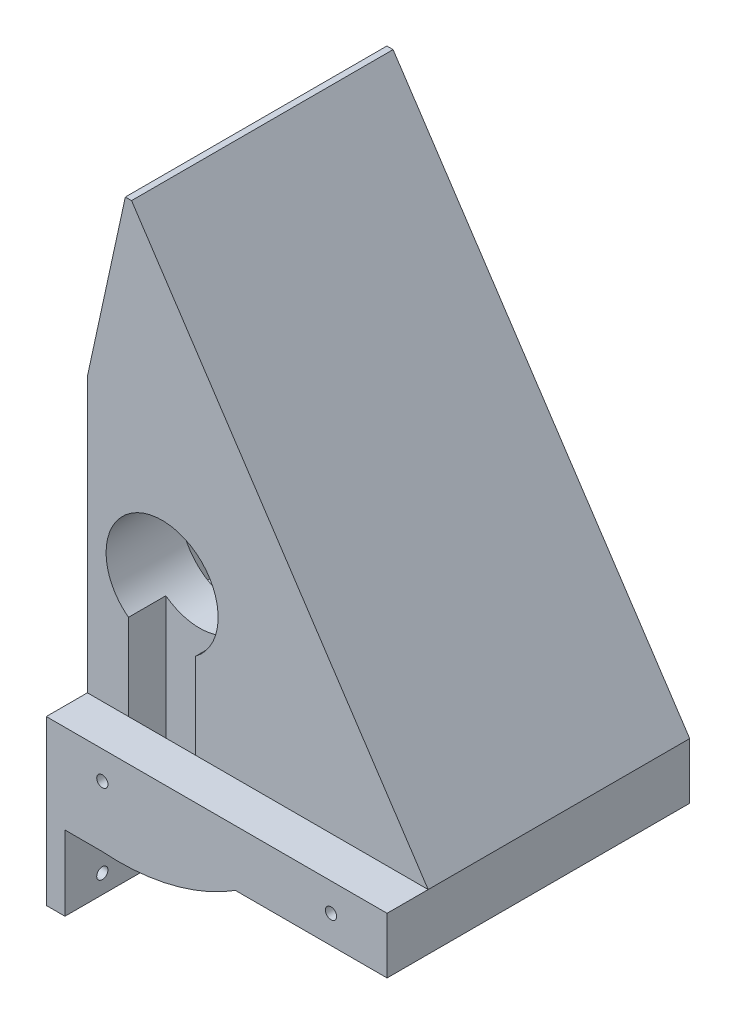
ISO-10303-21;
HEADER;
FILE_DESCRIPTION(('STEP AP214'),'2;1');
FILE_NAME('part.step','',(''),(''),'','','');
FILE_SCHEMA(('AUTOMOTIVE_DESIGN { 1 0 10303 214 1 1 1 1 }'));
ENDSEC;
DATA;
#1=APPLICATION_CONTEXT('core data for automotive mechanical design processes');
#2=APPLICATION_PROTOCOL_DEFINITION('international standard','automotive_design',2000,#1);
#3=PRODUCT_CONTEXT('',#1,'mechanical');
#4=PRODUCT('Part','Part','',(#3));
#5=PRODUCT_RELATED_PRODUCT_CATEGORY('part','',(#4));
#6=PRODUCT_DEFINITION_FORMATION('','',#4);
#7=PRODUCT_DEFINITION_CONTEXT('part definition',#1,'design');
#8=PRODUCT_DEFINITION('design','',#6,#7);
#9=PRODUCT_DEFINITION_SHAPE('','',#8);
#10=(LENGTH_UNIT() NAMED_UNIT(*) SI_UNIT(.MILLI.,.METRE.));
#11=(NAMED_UNIT(*) PLANE_ANGLE_UNIT() SI_UNIT($,.RADIAN.));
#12=(NAMED_UNIT(*) SI_UNIT($,.STERADIAN.) SOLID_ANGLE_UNIT());
#13=UNCERTAINTY_MEASURE_WITH_UNIT(LENGTH_MEASURE(1.E-05),#10,'distance_accuracy_value','');
#14=(GEOMETRIC_REPRESENTATION_CONTEXT(3) GLOBAL_UNCERTAINTY_ASSIGNED_CONTEXT((#13)) GLOBAL_UNIT_ASSIGNED_CONTEXT((#10,
#11,#12)) REPRESENTATION_CONTEXT('',''));
#15=CARTESIAN_POINT('',(0.,0.,0.));
#16=DIRECTION('',(0.,0.,1.));
#17=DIRECTION('',(1.,0.,0.));
#18=AXIS2_PLACEMENT_3D('',#15,#16,#17);
#19=CARTESIAN_POINT('',(-1.2E-05,-23.7978478395397,-270.));
#20=DIRECTION('',(0.,-1.,0.));
#21=DIRECTION('',(0.,0.,-1.));
#22=AXIS2_PLACEMENT_3D('',#19,#20,#21);
#23=PLANE('',#22);
#24=DIRECTION('',(1.,0.,0.));
#25=VECTOR('',#24,1.);
#26=CARTESIAN_POINT('',(0.,-23.7978478395397,-189.));
#27=LINE('',#26,#25);
#28=CARTESIAN_POINT('',(4.99999999999999,-23.7978478395397,-189.));
#29=VERTEX_POINT('',#28);
#30=CARTESIAN_POINT('',(15.,-23.7978478395397,-189.));
#31=VERTEX_POINT('',#30);
#32=EDGE_CURVE('E11',#29,#31,#27,.T.);
#33=ORIENTED_EDGE('',*,*,#32,.F.);
#34=DIRECTION('',(0.,0.,1.));
#35=VECTOR('',#34,1.);
#36=CARTESIAN_POINT('',(4.99999999999999,-23.7978478395397,-189.));
#37=LINE('',#36,#35);
#38=CARTESIAN_POINT('',(5.,-23.7978478395397,-270.));
#39=VERTEX_POINT('',#38);
#40=EDGE_CURVE('E252',#39,#29,#37,.T.);
#41=ORIENTED_EDGE('',*,*,#40,.F.);
#42=DIRECTION('',(1.,0.,0.));
#43=VECTOR('',#42,1.);
#44=CARTESIAN_POINT('',(-1.2E-05,-23.7978478395397,-270.));
#45=LINE('',#44,#43);
#46=CARTESIAN_POINT('',(15.,-23.7978478395397,-270.));
#47=VERTEX_POINT('',#46);
#48=EDGE_CURVE('E263',#39,#47,#45,.T.);
#49=ORIENTED_EDGE('',*,*,#48,.T.);
#50=DIRECTION('',(0.,0.,-1.));
#51=VECTOR('',#50,1.);
#52=CARTESIAN_POINT('',(15.,-23.7978478395397,-189.));
#53=LINE('',#52,#51);
#54=CARTESIAN_POINT('',(15.,-23.7978478395397,-210.));
#55=VERTEX_POINT('',#54);
#56=EDGE_CURVE('E289',#55,#47,#53,.T.);
#57=ORIENTED_EDGE('',*,*,#56,.F.);
#58=DIRECTION('',(1.,0.,0.));
#59=VECTOR('',#58,1.);
#60=CARTESIAN_POINT('',(0.,-23.7978478395397,-210.));
#61=LINE('',#60,#59);
#62=CARTESIAN_POINT('',(11.,-23.7978478395397,-210.));
#63=VERTEX_POINT('',#62);
#64=EDGE_CURVE('E269',#63,#55,#61,.T.);
#65=ORIENTED_EDGE('',*,*,#64,.F.);
#66=DIRECTION('',(0.,0.,1.));
#67=VECTOR('',#66,1.);
#68=CARTESIAN_POINT('',(11.,-23.7978478395397,-210.));
#69=LINE('',#68,#67);
#70=CARTESIAN_POINT('',(11.,-23.7978478395397,-200.));
#71=VERTEX_POINT('',#70);
#72=EDGE_CURVE('E267',#63,#71,#69,.T.);
#73=ORIENTED_EDGE('',*,*,#72,.T.);
#74=DIRECTION('',(1.,0.,0.));
#75=VECTOR('',#74,1.);
#76=CARTESIAN_POINT('',(11.,-23.7978478395397,-200.));
#77=LINE('',#76,#75);
#78=CARTESIAN_POINT('',(15.,-23.7978478395397,-200.));
#79=VERTEX_POINT('',#78);
#80=EDGE_CURVE('E265',#71,#79,#77,.T.);
#81=ORIENTED_EDGE('',*,*,#80,.T.);
#82=EDGE_CURVE('E296',#31,#79,#53,.T.);
#83=ORIENTED_EDGE('',*,*,#82,.F.);
#84=EDGE_LOOP('',(#33,#41,#49,#57,#65,#73,#81,#83));
#85=FACE_BOUND('',#84,.T.);
#86=ADVANCED_FACE('F41',(#85),#23,.T.);
#87=CARTESIAN_POINT('',(0.,-100.282814982748,-32.0135944600556));
#88=DIRECTION('',(1.,0.,0.));
#89=DIRECTION('',(0.,0.,-1.));
#90=AXIS2_PLACEMENT_3D('',#87,#88,#89);
#91=PLANE('',#90);
#92=CARTESIAN_POINT('',(0.,-38.7978478395397,-260.));
#93=DIRECTION('',(1.,0.,0.));
#94=DIRECTION('',(0.,0.,-1.));
#95=AXIS2_PLACEMENT_3D('',#92,#93,#94);
#96=CIRCLE('',#95,1.50000000000002);
#97=CARTESIAN_POINT('',(0.,-38.7978478395397,-261.5));
#98=VERTEX_POINT('',#97);
#99=EDGE_CURVE('E254',#98,#98,#96,.T.);
#100=ORIENTED_EDGE('',*,*,#99,.T.);
#101=EDGE_LOOP('',(#100));
#102=FACE_BOUND('',#101,.T.);
#103=CARTESIAN_POINT('',(0.,-38.7978478395397,-199.));
#104=DIRECTION('',(1.,0.,0.));
#105=DIRECTION('',(0.,0.,-1.));
#106=AXIS2_PLACEMENT_3D('',#103,#104,#105);
#107=CIRCLE('',#106,1.50000000000002);
#108=CARTESIAN_POINT('',(0.,-38.7978478395397,-200.5));
#109=VERTEX_POINT('',#108);
#110=EDGE_CURVE('E903',#109,#109,#107,.T.);
#111=ORIENTED_EDGE('',*,*,#110,.T.);
#112=EDGE_LOOP('',(#111));
#113=FACE_BOUND('',#112,.T.);
#114=DIRECTION('',(0.,1.,0.));
#115=VECTOR('',#114,1.);
#116=CARTESIAN_POINT('',(0.,0.,-270.));
#117=LINE('',#116,#115);
#118=CARTESIAN_POINT('',(0.,-43.7978478395397,-270.));
#119=VERTEX_POINT('',#118);
#120=CARTESIAN_POINT('',(0.,-4.35229791402416,-270.));
#121=VERTEX_POINT('',#120);
#122=EDGE_CURVE('E227',#119,#121,#117,.T.);
#123=ORIENTED_EDGE('',*,*,#122,.F.);
#124=DIRECTION('',(0.,0.,-1.));
#125=VECTOR('',#124,1.);
#126=CARTESIAN_POINT('',(0.,-43.7978478395397,-189.));
#127=LINE('',#126,#125);
#128=CARTESIAN_POINT('',(0.,-43.7978478395397,-189.));
#129=VERTEX_POINT('',#128);
#130=EDGE_CURVE('E232',#129,#119,#127,.T.);
#131=ORIENTED_EDGE('',*,*,#130,.F.);
#132=DIRECTION('',(0.,-1.,0.));
#133=VECTOR('',#132,1.);
#134=CARTESIAN_POINT('',(0.,0.,-189.));
#135=LINE('',#134,#133);
#136=CARTESIAN_POINT('',(0.,0.,-189.));
#137=VERTEX_POINT('',#136);
#138=EDGE_CURVE('E272',#137,#129,#135,.T.);
#139=ORIENTED_EDGE('',*,*,#138,.F.);
#140=DIRECTION('',(0.,0.,1.));
#141=VECTOR('',#140,1.);
#142=CARTESIAN_POINT('',(0.,0.,0.));
#143=LINE('',#142,#141);
#144=CARTESIAN_POINT('',(0.,0.,-200.));
#145=VERTEX_POINT('',#144);
#146=EDGE_CURVE('E238',#145,#137,#143,.T.);
#147=ORIENTED_EDGE('',*,*,#146,.F.);
#148=DIRECTION('',(0.,-1.,0.));
#149=VECTOR('',#148,1.);
#150=CARTESIAN_POINT('',(0.,120.,-200.));
#151=LINE('',#150,#149);
#152=CARTESIAN_POINT('',(0.,73.3522979140246,-200.));
#153=VERTEX_POINT('',#152);
#154=EDGE_CURVE('E239',#153,#145,#151,.T.);
#155=ORIENTED_EDGE('',*,*,#154,.F.);
#156=DIRECTION('',(0.,0.,1.));
#157=VECTOR('',#156,1.);
#158=CARTESIAN_POINT('',(0.,73.3522979140246,-270.));
#159=LINE('',#158,#157);
#160=CARTESIAN_POINT('',(0.,73.3522979140246,-240.));
#161=VERTEX_POINT('',#160);
#162=EDGE_CURVE('E405',#161,#153,#159,.T.);
#163=ORIENTED_EDGE('',*,*,#162,.F.);
#164=DIRECTION('',(0.,1.,0.));
#165=VECTOR('',#164,1.);
#166=CARTESIAN_POINT('',(0.,-4.35229791402416,-240.));
#167=LINE('',#166,#165);
#168=CARTESIAN_POINT('',(0.,-4.35229791402416,-240.));
#169=VERTEX_POINT('',#168);
#170=EDGE_CURVE('E364',#169,#161,#167,.T.);
#171=ORIENTED_EDGE('',*,*,#170,.F.);
#172=DIRECTION('',(0.,0.,-1.));
#173=VECTOR('',#172,1.);
#174=CARTESIAN_POINT('',(0.,-4.35229791402416,-240.));
#175=LINE('',#174,#173);
#176=EDGE_CURVE('E234',#169,#121,#175,.T.);
#177=ORIENTED_EDGE('',*,*,#176,.T.);
#178=EDGE_LOOP('',(#123,#131,#139,#147,#155,#163,#171,#177));
#179=FACE_BOUND('',#178,.T.);
#180=ADVANCED_FACE('F229',(#102,#113,#179),#91,.F.);
#181=CARTESIAN_POINT('',(30.,0.,-270.));
#182=DIRECTION('',(0.,0.,1.));
#183=DIRECTION('',(1.,0.,0.));
#184=AXIS2_PLACEMENT_3D('',#181,#182,#183);
#185=PLANE('',#184);
#186=ORIENTED_EDGE('',*,*,#48,.F.);
#187=DIRECTION('',(0.,1.,0.));
#188=VECTOR('',#187,1.);
#189=CARTESIAN_POINT('',(5.,-43.7978478395397,-270.));
#190=LINE('',#189,#188);
#191=CARTESIAN_POINT('',(5.,-43.7978478395397,-270.));
#192=VERTEX_POINT('',#191);
#193=EDGE_CURVE('E244',#192,#39,#190,.T.);
#194=ORIENTED_EDGE('',*,*,#193,.F.);
#195=DIRECTION('',(1.,0.,0.));
#196=VECTOR('',#195,1.);
#197=CARTESIAN_POINT('',(0.,-43.7978478395397,-270.));
#198=LINE('',#197,#196);
#199=EDGE_CURVE('E242',#119,#192,#198,.T.);
#200=ORIENTED_EDGE('',*,*,#199,.F.);
#201=ORIENTED_EDGE('',*,*,#122,.T.);
#202=CARTESIAN_POINT('',(19.5000000000004,34.5000000000002,-270.));
#203=DIRECTION('',(0.,0.,-1.));
#204=DIRECTION('',(-1.,0.,0.));
#205=AXIS2_PLACEMENT_3D('',#202,#203,#204);
#206=CIRCLE('',#205,43.471266984068);
#207=CARTESIAN_POINT('',(45.9480822215926,0.,-270.));
#208=VERTEX_POINT('',#207);
#209=EDGE_CURVE('E354',#208,#121,#206,.T.);
#210=ORIENTED_EDGE('',*,*,#209,.F.);
#211=DIRECTION('',(-1.,0.,0.));
#212=VECTOR('',#211,1.);
#213=CARTESIAN_POINT('',(30.,0.,-270.));
#214=LINE('',#213,#212);
#215=CARTESIAN_POINT('',(70.,0.,-270.));
#216=VERTEX_POINT('',#215);
#217=EDGE_CURVE('E424',#216,#208,#214,.T.);
#218=ORIENTED_EDGE('',*,*,#217,.F.);
#219=DIRECTION('',(0.,1.,0.));
#220=VECTOR('',#219,1.);
#221=CARTESIAN_POINT('',(70.,0.,-270.));
#222=LINE('',#221,#220);
#223=CARTESIAN_POINT('',(70.,26.1758846136216,-270.));
#224=VERTEX_POINT('',#223);
#225=EDGE_CURVE('E388',#216,#224,#222,.T.);
#226=ORIENTED_EDGE('',*,*,#225,.T.);
#227=DIRECTION('',(-0.551769207168103,0.833996847728505,0.));
#228=VECTOR('',#227,1.);
#229=CARTESIAN_POINT('',(70.,26.1758846136216,-270.));
#230=LINE('',#229,#228);
#231=CARTESIAN_POINT('',(38.6845798514309,73.5090111272283,-270.));
#232=VERTEX_POINT('',#231);
#233=EDGE_CURVE('E390',#224,#232,#230,.T.);
#234=ORIENTED_EDGE('',*,*,#233,.T.);
#235=CARTESIAN_POINT('',(19.5000000000004,34.5000000000003,-270.));
#236=DIRECTION('',(0.,0.,1.));
#237=DIRECTION('',(0.,1.,0.));
#238=AXIS2_PLACEMENT_3D('',#235,#236,#237);
#239=CIRCLE('',#238,43.471266984068);
#240=CARTESIAN_POINT('',(0.,73.3522979140247,-270.));
#241=VERTEX_POINT('',#240);
#242=EDGE_CURVE('E375',#232,#241,#239,.T.);
#243=ORIENTED_EDGE('',*,*,#242,.T.);
#244=DIRECTION('',(0.212686858193502,0.977120412411785,0.));
#245=VECTOR('',#244,1.);
#246=CARTESIAN_POINT('',(0.,73.3522979140247,-270.));
#247=LINE('',#246,#245);
#248=CARTESIAN_POINT('',(10.1536648631914,120.,-270.));
#249=VERTEX_POINT('',#248);
#250=EDGE_CURVE('E379',#241,#249,#247,.T.);
#251=ORIENTED_EDGE('',*,*,#250,.T.);
#252=DIRECTION('',(1.,0.,0.));
#253=VECTOR('',#252,1.);
#254=CARTESIAN_POINT('',(10.1536648631914,120.,-270.));
#255=LINE('',#254,#253);
#256=CARTESIAN_POINT('',(11.8199212825175,120.,-270.));
#257=VERTEX_POINT('',#256);
#258=EDGE_CURVE('E382',#249,#257,#255,.T.);
#259=ORIENTED_EDGE('',*,*,#258,.T.);
#260=DIRECTION('',(0.551769207168103,-0.833996847728505,0.));
#261=VECTOR('',#260,1.);
#262=CARTESIAN_POINT('',(11.8199212825175,120.,-270.));
#263=LINE('',#262,#261);
#264=CARTESIAN_POINT('',(91.2114741888743,0.,-270.));
#265=VERTEX_POINT('',#264);
#266=EDGE_CURVE('E385',#257,#265,#263,.T.);
#267=ORIENTED_EDGE('',*,*,#266,.T.);
#268=DIRECTION('',(0.,1.,0.));
#269=VECTOR('',#268,1.);
#270=CARTESIAN_POINT('',(91.2114741888743,-170.,-270.));
#271=LINE('',#270,#269);
#272=CARTESIAN_POINT('',(91.2114741888743,-15.,-270.));
#273=VERTEX_POINT('',#272);
#274=EDGE_CURVE('E295',#273,#265,#271,.T.);
#275=ORIENTED_EDGE('',*,*,#274,.F.);
#276=DIRECTION('',(1.,0.,0.));
#277=VECTOR('',#276,1.);
#278=CARTESIAN_POINT('',(50.6229668046309,-15.,-270.));
#279=LINE('',#278,#277);
#280=CARTESIAN_POINT('',(50.6229668046309,-15.,-270.));
#281=VERTEX_POINT('',#280);
#282=EDGE_CURVE('E285',#281,#273,#279,.T.);
#283=ORIENTED_EDGE('',*,*,#282,.F.);
#284=CARTESIAN_POINT('',(19.5000000000004,34.5000000000002,-270.));
#285=DIRECTION('',(0.,0.,1.));
#286=DIRECTION('',(-1.,0.,0.));
#287=AXIS2_PLACEMENT_3D('',#284,#285,#286);
#288=CIRCLE('',#287,58.471266984068);
#289=EDGE_CURVE('E281',#47,#281,#288,.T.);
#290=ORIENTED_EDGE('',*,*,#289,.F.);
#291=EDGE_LOOP('',(#186,#194,#200,#201,#210,#218,#226,#234,#243,#251,#259,#267,#275,#283,#290));
#292=FACE_BOUND('',#291,.T.);
#293=ADVANCED_FACE('F43',(#292),#185,.F.);
#294=CARTESIAN_POINT('',(0.,0.,-210.));
#295=DIRECTION('',(0.,0.,1.));
#296=DIRECTION('',(1.,0.,0.));
#297=AXIS2_PLACEMENT_3D('',#294,#295,#296);
#298=PLANE('',#297);
#299=DIRECTION('',(0.,-1.,0.));
#300=VECTOR('',#299,1.);
#301=CARTESIAN_POINT('',(11.,0.,-210.));
#302=LINE('',#301,#300);
#303=CARTESIAN_POINT('',(11.,23.0000000000001,-210.));
#304=VERTEX_POINT('',#303);
#305=EDGE_CURVE('E307',#304,#63,#302,.T.);
#306=ORIENTED_EDGE('',*,*,#305,.T.);
#307=ORIENTED_EDGE('',*,*,#64,.T.);
#308=CARTESIAN_POINT('',(19.5000000000004,34.5000000000002,-210.));
#309=DIRECTION('',(0.,0.,-1.));
#310=DIRECTION('',(0.,1.,0.));
#311=AXIS2_PLACEMENT_3D('',#308,#309,#310);
#312=CIRCLE('',#311,58.471266984068);
#313=CARTESIAN_POINT('',(29.,-23.1943590199435,-210.));
#314=VERTEX_POINT('',#313);
#315=EDGE_CURVE('E49',#314,#55,#312,.T.);
#316=ORIENTED_EDGE('',*,*,#315,.F.);
#317=DIRECTION('',(0.,1.,0.));
#318=VECTOR('',#317,1.);
#319=CARTESIAN_POINT('',(29.,0.,-210.));
#320=LINE('',#319,#318);
#321=CARTESIAN_POINT('',(29.,23.,-210.));
#322=VERTEX_POINT('',#321);
#323=EDGE_CURVE('E304',#314,#322,#320,.T.);
#324=ORIENTED_EDGE('',*,*,#323,.T.);
#325=CARTESIAN_POINT('',(20.0000000000001,35.,-210.));
#326=DIRECTION('',(0.,0.,1.));
#327=DIRECTION('',(1.,0.,0.));
#328=AXIS2_PLACEMENT_3D('',#325,#326,#327);
#329=CIRCLE('',#328,15.);
#330=EDGE_CURVE('E433',#322,#304,#329,.F.);
#331=ORIENTED_EDGE('',*,*,#330,.T.);
#332=EDGE_LOOP('',(#306,#307,#316,#324,#331));
#333=FACE_BOUND('',#332,.T.);
#334=ADVANCED_FACE('F450',(#333),#298,.T.);
#335=CARTESIAN_POINT('',(11.,0.,-210.));
#336=DIRECTION('',(-1.,0.,0.));
#337=DIRECTION('',(0.,-1.,0.));
#338=AXIS2_PLACEMENT_3D('',#335,#336,#337);
#339=PLANE('',#338);
#340=ORIENTED_EDGE('',*,*,#72,.F.);
#341=ORIENTED_EDGE('',*,*,#305,.F.);
#342=DIRECTION('',(0.,0.,-1.));
#343=VECTOR('',#342,1.);
#344=CARTESIAN_POINT('',(11.,23.,0.));
#345=LINE('',#344,#343);
#346=CARTESIAN_POINT('',(11.,23.0000000000001,-200.));
#347=VERTEX_POINT('',#346);
#348=EDGE_CURVE('E314',#347,#304,#345,.T.);
#349=ORIENTED_EDGE('',*,*,#348,.F.);
#350=DIRECTION('',(0.,1.,0.));
#351=VECTOR('',#350,1.);
#352=CARTESIAN_POINT('',(11.,120.,-200.));
#353=LINE('',#352,#351);
#354=CARTESIAN_POINT('',(11.,0.,-200.));
#355=VERTEX_POINT('',#354);
#356=EDGE_CURVE('E430',#355,#347,#353,.T.);
#357=ORIENTED_EDGE('',*,*,#356,.F.);
#358=DIRECTION('',(0.,1.,0.));
#359=VECTOR('',#358,1.);
#360=CARTESIAN_POINT('',(11.,-60.,-200.));
#361=LINE('',#360,#359);
#362=EDGE_CURVE('E276',#71,#355,#361,.T.);
#363=ORIENTED_EDGE('',*,*,#362,.F.);
#364=EDGE_LOOP('',(#340,#341,#349,#357,#363));
#365=FACE_BOUND('',#364,.T.);
#366=ADVANCED_FACE('F459',(#365),#339,.F.);
#367=CARTESIAN_POINT('',(11.,-60.,-200.));
#368=DIRECTION('',(0.,0.,1.));
#369=DIRECTION('',(0.,-1.,0.));
#370=AXIS2_PLACEMENT_3D('',#367,#368,#369);
#371=PLANE('',#370);
#372=ORIENTED_EDGE('',*,*,#80,.F.);
#373=ORIENTED_EDGE('',*,*,#362,.T.);
#374=DIRECTION('',(1.,0.,0.));
#375=VECTOR('',#374,1.);
#376=CARTESIAN_POINT('',(11.,0.,-200.));
#377=LINE('',#376,#375);
#378=CARTESIAN_POINT('',(29.,0.,-200.));
#379=VERTEX_POINT('',#378);
#380=EDGE_CURVE('E278',#355,#379,#377,.T.);
#381=ORIENTED_EDGE('',*,*,#380,.T.);
#382=DIRECTION('',(0.,1.,0.));
#383=VECTOR('',#382,1.);
#384=CARTESIAN_POINT('',(29.,-60.,-200.));
#385=LINE('',#384,#383);
#386=CARTESIAN_POINT('',(29.,-23.1943590199435,-200.));
#387=VERTEX_POINT('',#386);
#388=EDGE_CURVE('E63',#387,#379,#385,.T.);
#389=ORIENTED_EDGE('',*,*,#388,.F.);
#390=CARTESIAN_POINT('',(19.5000000000004,34.5000000000002,-200.));
#391=DIRECTION('',(0.,0.,1.));
#392=DIRECTION('',(0.,-1.,0.));
#393=AXIS2_PLACEMENT_3D('',#390,#391,#392);
#394=CIRCLE('',#393,58.471266984068);
#395=EDGE_CURVE('E438',#79,#387,#394,.T.);
#396=ORIENTED_EDGE('',*,*,#395,.F.);
#397=EDGE_LOOP('',(#372,#373,#381,#389,#396));
#398=FACE_BOUND('',#397,.T.);
#399=ADVANCED_FACE('F462',(#398),#371,.F.);
#400=CARTESIAN_POINT('',(0.,0.,-189.));
#401=DIRECTION('',(0.,0.,1.));
#402=DIRECTION('',(1.,0.,0.));
#403=AXIS2_PLACEMENT_3D('',#400,#401,#402);
#404=PLANE('',#403);
#405=CARTESIAN_POINT('',(15.,-7.49999999999999,-189.));
#406=DIRECTION('',(0.,0.,1.));
#407=DIRECTION('',(1.,0.,0.));
#408=AXIS2_PLACEMENT_3D('',#405,#406,#407);
#409=CIRCLE('',#408,1.5);
#410=CARTESIAN_POINT('',(16.5,-7.49999999999999,-189.));
#411=VERTEX_POINT('',#410);
#412=EDGE_CURVE('E888',#411,#411,#409,.T.);
#413=ORIENTED_EDGE('',*,*,#412,.F.);
#414=EDGE_LOOP('',(#413));
#415=FACE_BOUND('',#414,.T.);
#416=CARTESIAN_POINT('',(76.2114741888743,-7.49999999999999,-189.));
#417=DIRECTION('',(0.,0.,1.));
#418=DIRECTION('',(1.,0.,0.));
#419=AXIS2_PLACEMENT_3D('',#416,#417,#418);
#420=CIRCLE('',#419,1.5);
#421=CARTESIAN_POINT('',(77.7114741888743,-7.49999999999999,-189.));
#422=VERTEX_POINT('',#421);
#423=EDGE_CURVE('E894',#422,#422,#420,.T.);
#424=ORIENTED_EDGE('',*,*,#423,.F.);
#425=EDGE_LOOP('',(#424));
#426=FACE_BOUND('',#425,.T.);
#427=ORIENTED_EDGE('',*,*,#138,.T.);
#428=DIRECTION('',(-1.,0.,0.));
#429=VECTOR('',#428,1.);
#430=CARTESIAN_POINT('',(0.,-43.7978478395397,-189.));
#431=LINE('',#430,#429);
#432=CARTESIAN_POINT('',(4.99999999999999,-43.7978478395397,-189.));
#433=VERTEX_POINT('',#432);
#434=EDGE_CURVE('E251',#433,#129,#431,.T.);
#435=ORIENTED_EDGE('',*,*,#434,.F.);
#436=DIRECTION('',(0.,1.,0.));
#437=VECTOR('',#436,1.);
#438=CARTESIAN_POINT('',(4.99999999999999,-43.7978478395397,-189.));
#439=LINE('',#438,#437);
#440=EDGE_CURVE('E55',#433,#29,#439,.T.);
#441=ORIENTED_EDGE('',*,*,#440,.T.);
#442=ORIENTED_EDGE('',*,*,#32,.T.);
#443=CARTESIAN_POINT('',(19.5000000000004,34.5000000000002,-189.));
#444=DIRECTION('',(0.,0.,1.));
#445=DIRECTION('',(-1.,0.,0.));
#446=AXIS2_PLACEMENT_3D('',#443,#444,#445);
#447=CIRCLE('',#446,58.471266984068);
#448=CARTESIAN_POINT('',(50.6229668046309,-15.,-189.));
#449=VERTEX_POINT('',#448);
#450=EDGE_CURVE('E282',#31,#449,#447,.T.);
#451=ORIENTED_EDGE('',*,*,#450,.T.);
#452=DIRECTION('',(1.,0.,0.));
#453=VECTOR('',#452,1.);
#454=CARTESIAN_POINT('',(50.6229668046309,-15.,-189.));
#455=LINE('',#454,#453);
#456=CARTESIAN_POINT('',(91.2114741888743,-15.,-189.));
#457=VERTEX_POINT('',#456);
#458=EDGE_CURVE('E284',#449,#457,#455,.T.);
#459=ORIENTED_EDGE('',*,*,#458,.T.);
#460=DIRECTION('',(0.,1.,0.));
#461=VECTOR('',#460,1.);
#462=CARTESIAN_POINT('',(91.2114741888743,-15.,-189.));
#463=LINE('',#462,#461);
#464=CARTESIAN_POINT('',(91.2114741888743,0.,-189.));
#465=VERTEX_POINT('',#464);
#466=EDGE_CURVE('E287',#457,#465,#463,.T.);
#467=ORIENTED_EDGE('',*,*,#466,.T.);
#468=DIRECTION('',(-1.,0.,0.));
#469=VECTOR('',#468,1.);
#470=CARTESIAN_POINT('',(30.,0.,-189.));
#471=LINE('',#470,#469);
#472=EDGE_CURVE('E274',#465,#137,#471,.T.);
#473=ORIENTED_EDGE('',*,*,#472,.T.);
#474=EDGE_LOOP('',(#427,#435,#441,#442,#451,#459,#467,#473));
#475=FACE_BOUND('',#474,.T.);
#476=ADVANCED_FACE('F502',(#415,#426,#475),#404,.T.);
#477=CARTESIAN_POINT('',(30.,0.,0.));
#478=DIRECTION('',(0.,-1.,0.));
#479=DIRECTION('',(0.,0.,-1.));
#480=AXIS2_PLACEMENT_3D('',#477,#478,#479);
#481=PLANE('',#480);
#482=ORIENTED_EDGE('',*,*,#472,.F.);
#483=DIRECTION('',(0.,0.,1.));
#484=VECTOR('',#483,1.);
#485=CARTESIAN_POINT('',(91.2114741888743,0.,-190.));
#486=LINE('',#485,#484);
#487=CARTESIAN_POINT('',(91.2114741888743,0.,-200.));
#488=VERTEX_POINT('',#487);
#489=EDGE_CURVE('E300',#488,#465,#486,.T.);
#490=ORIENTED_EDGE('',*,*,#489,.F.);
#491=DIRECTION('',(1.,0.,0.));
#492=VECTOR('',#491,1.);
#493=CARTESIAN_POINT('',(0.,0.,-200.));
#494=LINE('',#493,#492);
#495=EDGE_CURVE('E414',#379,#488,#494,.T.);
#496=ORIENTED_EDGE('',*,*,#495,.F.);
#497=ORIENTED_EDGE('',*,*,#380,.F.);
#498=EDGE_CURVE('E418',#145,#355,#494,.T.);
#499=ORIENTED_EDGE('',*,*,#498,.F.);
#500=ORIENTED_EDGE('',*,*,#146,.T.);
#501=EDGE_LOOP('',(#482,#490,#496,#497,#499,#500));
#502=FACE_BOUND('',#501,.T.);
#503=ADVANCED_FACE('F467',(#502),#481,.F.);
#504=CARTESIAN_POINT('',(20.,35.,0.));
#505=DIRECTION('',(0.,0.,-1.));
#506=DIRECTION('',(-1.,0.,0.));
#507=AXIS2_PLACEMENT_3D('',#504,#505,#506);
#508=CYLINDRICAL_SURFACE('',#507,15.);
#509=CARTESIAN_POINT('',(20.0000000000001,35.,-200.));
#510=DIRECTION('',(0.,0.,-1.));
#511=DIRECTION('',(-1.,0.,0.));
#512=AXIS2_PLACEMENT_3D('',#509,#510,#511);
#513=CIRCLE('',#512,15.);
#514=CARTESIAN_POINT('',(29.,23.,-200.));
#515=VERTEX_POINT('',#514);
#516=EDGE_CURVE('E345',#347,#515,#513,.T.);
#517=ORIENTED_EDGE('',*,*,#516,.F.);
#518=ORIENTED_EDGE('',*,*,#348,.T.);
#519=ORIENTED_EDGE('',*,*,#330,.F.);
#520=DIRECTION('',(0.,0.,-1.));
#521=VECTOR('',#520,1.);
#522=CARTESIAN_POINT('',(29.,23.,0.));
#523=LINE('',#522,#521);
#524=EDGE_CURVE('E310',#322,#515,#523,.F.);
#525=ORIENTED_EDGE('',*,*,#524,.T.);
#526=EDGE_LOOP('',(#517,#518,#519,#525));
#527=FACE_BOUND('',#526,.T.);
#528=CARTESIAN_POINT('',(20.0000000000001,35.,-220.));
#529=DIRECTION('',(0.,0.,-1.));
#530=DIRECTION('',(-1.,0.,0.));
#531=AXIS2_PLACEMENT_3D('',#528,#529,#530);
#532=CIRCLE('',#531,15.);
#533=CARTESIAN_POINT('',(5.00000000000002,35.,-220.));
#534=VERTEX_POINT('',#533);
#535=CARTESIAN_POINT('',(35.,35.,-220.));
#536=VERTEX_POINT('',#535);
#537=EDGE_CURVE('E429',#534,#536,#532,.F.);
#538=ORIENTED_EDGE('',*,*,#537,.F.);
#539=EDGE_CURVE('E427',#536,#534,#532,.F.);
#540=ORIENTED_EDGE('',*,*,#539,.F.);
#541=EDGE_LOOP('',(#538,#540));
#542=FACE_BOUND('',#541,.T.);
#543=ADVANCED_FACE('F567',(#527,#542),#508,.F.);
#544=ORIENTED_EDGE('',*,*,#217,.T.);
#545=DIRECTION('',(0.,0.,-1.));
#546=VECTOR('',#545,1.);
#547=CARTESIAN_POINT('',(45.9480822215926,0.,-240.));
#548=LINE('',#547,#546);
#549=CARTESIAN_POINT('',(45.9480822215926,0.,-240.));
#550=VERTEX_POINT('',#549);
#551=EDGE_CURVE('E372',#550,#208,#548,.T.);
#552=ORIENTED_EDGE('',*,*,#551,.F.);
#553=DIRECTION('',(-1.,0.,0.));
#554=VECTOR('',#553,1.);
#555=CARTESIAN_POINT('',(70.,0.,-240.));
#556=LINE('',#555,#554);
#557=CARTESIAN_POINT('',(70.,0.,-240.));
#558=VERTEX_POINT('',#557);
#559=EDGE_CURVE('E358',#558,#550,#556,.T.);
#560=ORIENTED_EDGE('',*,*,#559,.F.);
#561=DIRECTION('',(0.,0.,1.));
#562=VECTOR('',#561,1.);
#563=CARTESIAN_POINT('',(70.,0.,-270.));
#564=LINE('',#563,#562);
#565=EDGE_CURVE('E396',#216,#558,#564,.T.);
#566=ORIENTED_EDGE('',*,*,#565,.F.);
#567=EDGE_LOOP('',(#544,#552,#560,#566));
#568=FACE_BOUND('',#567,.T.);
#569=ADVANCED_FACE('F570',(#568),#481,.F.);
#570=CARTESIAN_POINT('',(0.,120.,-200.));
#571=DIRECTION('',(0.,0.,-1.));
#572=DIRECTION('',(-1.,0.,0.));
#573=AXIS2_PLACEMENT_3D('',#570,#571,#572);
#574=PLANE('',#573);
#575=ORIENTED_EDGE('',*,*,#498,.T.);
#576=ORIENTED_EDGE('',*,*,#356,.T.);
#577=ORIENTED_EDGE('',*,*,#516,.T.);
#578=DIRECTION('',(0.,1.,0.));
#579=VECTOR('',#578,1.);
#580=CARTESIAN_POINT('',(29.,0.,-200.));
#581=LINE('',#580,#579);
#582=EDGE_CURVE('E303',#379,#515,#581,.T.);
#583=ORIENTED_EDGE('',*,*,#582,.F.);
#584=ORIENTED_EDGE('',*,*,#495,.T.);
#585=DIRECTION('',(-0.551769207168104,0.833996847728504,0.));
#586=VECTOR('',#585,1.);
#587=CARTESIAN_POINT('',(8.2213550186858,125.439217849399,-200.));
#588=LINE('',#587,#586);
#589=CARTESIAN_POINT('',(11.8199212825175,120.,-200.));
#590=VERTEX_POINT('',#589);
#591=EDGE_CURVE('E401',#488,#590,#588,.T.);
#592=ORIENTED_EDGE('',*,*,#591,.T.);
#593=DIRECTION('',(1.,0.,0.));
#594=VECTOR('',#593,1.);
#595=CARTESIAN_POINT('',(0.,120.,-200.));
#596=LINE('',#595,#594);
#597=CARTESIAN_POINT('',(10.1536648631914,120.,-200.));
#598=VERTEX_POINT('',#597);
#599=EDGE_CURVE('E415',#598,#590,#596,.T.);
#600=ORIENTED_EDGE('',*,*,#599,.F.);
#601=DIRECTION('',(-0.212686858193503,-0.977120412411785,0.));
#602=VECTOR('',#601,1.);
#603=CARTESIAN_POINT('',(9.69435672911133,117.889858559159,-200.));
#604=LINE('',#603,#602);
#605=EDGE_CURVE('E409',#598,#153,#604,.T.);
#606=ORIENTED_EDGE('',*,*,#605,.T.);
#607=ORIENTED_EDGE('',*,*,#154,.T.);
#608=EDGE_LOOP('',(#575,#576,#577,#583,#584,#592,#600,#606,#607));
#609=FACE_BOUND('',#608,.T.);
#610=ADVANCED_FACE('F473',(#609),#574,.F.);
#611=CARTESIAN_POINT('',(0.,120.,0.));
#612=DIRECTION('',(0.,-1.,0.));
#613=DIRECTION('',(0.,0.,-1.));
#614=AXIS2_PLACEMENT_3D('',#611,#612,#613);
#615=PLANE('',#614);
#616=ORIENTED_EDGE('',*,*,#599,.T.);
#617=DIRECTION('',(0.,0.,1.));
#618=VECTOR('',#617,1.);
#619=CARTESIAN_POINT('',(11.8199212825175,120.,-270.));
#620=LINE('',#619,#618);
#621=EDGE_CURVE('E399',#257,#590,#620,.T.);
#622=ORIENTED_EDGE('',*,*,#621,.F.);
#623=ORIENTED_EDGE('',*,*,#258,.F.);
#624=DIRECTION('',(0.,0.,1.));
#625=VECTOR('',#624,1.);
#626=CARTESIAN_POINT('',(10.1536648631914,120.,-270.));
#627=LINE('',#626,#625);
#628=EDGE_CURVE('E406',#249,#598,#627,.T.);
#629=ORIENTED_EDGE('',*,*,#628,.T.);
#630=EDGE_LOOP('',(#616,#622,#623,#629));
#631=FACE_BOUND('',#630,.T.);
#632=ADVANCED_FACE('F481',(#631),#615,.F.);
#633=CARTESIAN_POINT('',(0.,73.3522979140246,-270.));
#634=DIRECTION('',(0.977120412411785,-0.212686858193503,0.));
#635=DIRECTION('',(0.212686858193503,0.977120412411785,0.));
#636=AXIS2_PLACEMENT_3D('',#633,#634,#635);
#637=PLANE('',#636);
#638=EDGE_CURVE('E410',#241,#161,#159,.T.);
#639=ORIENTED_EDGE('',*,*,#638,.T.);
#640=ORIENTED_EDGE('',*,*,#162,.T.);
#641=ORIENTED_EDGE('',*,*,#605,.F.);
#642=ORIENTED_EDGE('',*,*,#628,.F.);
#643=ORIENTED_EDGE('',*,*,#250,.F.);
#644=EDGE_LOOP('',(#639,#640,#641,#642,#643));
#645=FACE_BOUND('',#644,.T.);
#646=ADVANCED_FACE('F487',(#645),#637,.F.);
#647=CARTESIAN_POINT('',(44.8997349934995,70.,-270.));
#648=DIRECTION('',(-0.833996847728505,-0.551769207168104,0.));
#649=DIRECTION('',(0.551769207168104,-0.833996847728504,0.));
#650=AXIS2_PLACEMENT_3D('',#647,#648,#649);
#651=PLANE('',#650);
#652=ORIENTED_EDGE('',*,*,#621,.T.);
#653=ORIENTED_EDGE('',*,*,#591,.F.);
#654=DIRECTION('',(0.,0.,1.));
#655=VECTOR('',#654,1.);
#656=CARTESIAN_POINT('',(91.2114741888743,0.,-270.));
#657=LINE('',#656,#655);
#658=EDGE_CURVE('E398',#265,#488,#657,.T.);
#659=ORIENTED_EDGE('',*,*,#658,.F.);
#660=ORIENTED_EDGE('',*,*,#266,.F.);
#661=EDGE_LOOP('',(#652,#653,#659,#660));
#662=FACE_BOUND('',#661,.T.);
#663=ADVANCED_FACE('F477',(#662),#651,.F.);
#664=CARTESIAN_POINT('',(19.5000000000004,34.5000000000003,-270.));
#665=DIRECTION('',(0.,0.,1.));
#666=DIRECTION('',(0.,-1.,0.));
#667=AXIS2_PLACEMENT_3D('',#664,#665,#666);
#668=CYLINDRICAL_SURFACE('',#667,43.471266984068);
#669=DIRECTION('',(0.,0.,1.));
#670=VECTOR('',#669,1.);
#671=CARTESIAN_POINT('',(38.6845798514309,73.5090111272283,-270.));
#672=LINE('',#671,#670);
#673=CARTESIAN_POINT('',(38.6845798514309,73.5090111272283,-240.));
#674=VERTEX_POINT('',#673);
#675=EDGE_CURVE('E392',#232,#674,#672,.T.);
#676=ORIENTED_EDGE('',*,*,#675,.T.);
#677=CARTESIAN_POINT('',(19.5000000000004,34.5000000000002,-240.));
#678=DIRECTION('',(0.,0.,-1.));
#679=DIRECTION('',(-1.,0.,0.));
#680=AXIS2_PLACEMENT_3D('',#677,#678,#679);
#681=CIRCLE('',#680,43.471266984068);
#682=EDGE_CURVE('E366',#161,#674,#681,.T.);
#683=ORIENTED_EDGE('',*,*,#682,.F.);
#684=ORIENTED_EDGE('',*,*,#638,.F.);
#685=ORIENTED_EDGE('',*,*,#242,.F.);
#686=EDGE_LOOP('',(#676,#683,#684,#685));
#687=FACE_BOUND('',#686,.T.);
#688=ADVANCED_FACE('F586',(#687),#668,.F.);
#689=CARTESIAN_POINT('',(70.,0.,-270.));
#690=DIRECTION('',(1.,0.,0.));
#691=DIRECTION('',(0.,1.,0.));
#692=AXIS2_PLACEMENT_3D('',#689,#690,#691);
#693=PLANE('',#692);
#694=ORIENTED_EDGE('',*,*,#565,.T.);
#695=DIRECTION('',(0.,-1.,0.));
#696=VECTOR('',#695,1.);
#697=CARTESIAN_POINT('',(70.,26.1758846136215,-240.));
#698=LINE('',#697,#696);
#699=CARTESIAN_POINT('',(70.,26.1758846136215,-240.));
#700=VERTEX_POINT('',#699);
#701=EDGE_CURVE('E355',#700,#558,#698,.T.);
#702=ORIENTED_EDGE('',*,*,#701,.F.);
#703=DIRECTION('',(0.,0.,1.));
#704=VECTOR('',#703,1.);
#705=CARTESIAN_POINT('',(70.,26.1758846136216,-270.));
#706=LINE('',#705,#704);
#707=EDGE_CURVE('E394',#224,#700,#706,.T.);
#708=ORIENTED_EDGE('',*,*,#707,.F.);
#709=ORIENTED_EDGE('',*,*,#225,.F.);
#710=EDGE_LOOP('',(#694,#702,#708,#709));
#711=FACE_BOUND('',#710,.T.);
#712=ADVANCED_FACE('F582',(#711),#693,.F.);
#713=CARTESIAN_POINT('',(70.,26.1758846136216,-270.));
#714=DIRECTION('',(0.833996847728505,0.551769207168103,0.));
#715=DIRECTION('',(-0.551769207168103,0.833996847728505,0.));
#716=AXIS2_PLACEMENT_3D('',#713,#714,#715);
#717=PLANE('',#716);
#718=ORIENTED_EDGE('',*,*,#707,.T.);
#719=DIRECTION('',(0.551769207168104,-0.833996847728504,0.));
#720=VECTOR('',#719,1.);
#721=CARTESIAN_POINT('',(38.6845798514309,73.5090111272283,-240.));
#722=LINE('',#721,#720);
#723=EDGE_CURVE('E369',#674,#700,#722,.T.);
#724=ORIENTED_EDGE('',*,*,#723,.F.);
#725=ORIENTED_EDGE('',*,*,#675,.F.);
#726=ORIENTED_EDGE('',*,*,#233,.F.);
#727=EDGE_LOOP('',(#718,#724,#725,#726));
#728=FACE_BOUND('',#727,.T.);
#729=ADVANCED_FACE('F578',(#728),#717,.F.);
#730=CARTESIAN_POINT('',(19.5000000000004,34.5000000000002,-240.));
#731=DIRECTION('',(0.,0.,-1.));
#732=DIRECTION('',(-1.,0.,0.));
#733=AXIS2_PLACEMENT_3D('',#730,#731,#732);
#734=CYLINDRICAL_SURFACE('',#733,43.471266984068);
#735=ORIENTED_EDGE('',*,*,#209,.T.);
#736=ORIENTED_EDGE('',*,*,#176,.F.);
#737=CARTESIAN_POINT('',(19.5000000000004,34.5000000000002,-240.));
#738=DIRECTION('',(0.,0.,-1.));
#739=DIRECTION('',(-1.,0.,0.));
#740=AXIS2_PLACEMENT_3D('',#737,#738,#739);
#741=CIRCLE('',#740,43.471266984068);
#742=EDGE_CURVE('E361',#550,#169,#741,.T.);
#743=ORIENTED_EDGE('',*,*,#742,.F.);
#744=ORIENTED_EDGE('',*,*,#551,.T.);
#745=EDGE_LOOP('',(#735,#736,#743,#744));
#746=FACE_BOUND('',#745,.T.);
#747=ADVANCED_FACE('F574',(#746),#734,.F.);
#748=CARTESIAN_POINT('',(19.5000000000004,34.5000000000002,-240.));
#749=DIRECTION('',(0.,0.,-1.));
#750=DIRECTION('',(-1.,0.,0.));
#751=AXIS2_PLACEMENT_3D('',#748,#749,#750);
#752=PLANE('',#751);
#753=DIRECTION('',(1.,0.,0.));
#754=VECTOR('',#753,1.);
#755=CARTESIAN_POINT('',(35.,55.,-240.));
#756=LINE('',#755,#754);
#757=CARTESIAN_POINT('',(5.00000000000002,55.,-240.));
#758=VERTEX_POINT('',#757);
#759=CARTESIAN_POINT('',(35.,55.,-240.));
#760=VERTEX_POINT('',#759);
#761=EDGE_CURVE('E339',#758,#760,#756,.T.);
#762=ORIENTED_EDGE('',*,*,#761,.F.);
#763=DIRECTION('',(0.,1.,0.));
#764=VECTOR('',#763,1.);
#765=CARTESIAN_POINT('',(5.00000000000002,55.,-240.));
#766=LINE('',#765,#764);
#767=CARTESIAN_POINT('',(5.00000000000002,15.,-240.));
#768=VERTEX_POINT('',#767);
#769=EDGE_CURVE('E337',#768,#758,#766,.T.);
#770=ORIENTED_EDGE('',*,*,#769,.F.);
#771=DIRECTION('',(-1.,0.,0.));
#772=VECTOR('',#771,1.);
#773=CARTESIAN_POINT('',(35.,15.,-240.));
#774=LINE('',#773,#772);
#775=CARTESIAN_POINT('',(35.,15.,-240.));
#776=VERTEX_POINT('',#775);
#777=EDGE_CURVE('E334',#776,#768,#774,.T.);
#778=ORIENTED_EDGE('',*,*,#777,.F.);
#779=DIRECTION('',(0.,-1.,0.));
#780=VECTOR('',#779,1.);
#781=CARTESIAN_POINT('',(35.,55.,-240.));
#782=LINE('',#781,#780);
#783=EDGE_CURVE('E317',#760,#776,#782,.T.);
#784=ORIENTED_EDGE('',*,*,#783,.F.);
#785=EDGE_LOOP('',(#762,#770,#778,#784));
#786=FACE_BOUND('',#785,.T.);
#787=ORIENTED_EDGE('',*,*,#701,.T.);
#788=ORIENTED_EDGE('',*,*,#559,.T.);
#789=ORIENTED_EDGE('',*,*,#742,.T.);
#790=ORIENTED_EDGE('',*,*,#170,.T.);
#791=ORIENTED_EDGE('',*,*,#682,.T.);
#792=ORIENTED_EDGE('',*,*,#723,.T.);
#793=EDGE_LOOP('',(#787,#788,#789,#790,#791,#792));
#794=FACE_BOUND('',#793,.T.);
#795=ADVANCED_FACE('F565',(#786,#794),#752,.T.);
#796=CARTESIAN_POINT('',(35.,55.,-220.));
#797=DIRECTION('',(1.,0.,0.));
#798=DIRECTION('',(0.,1.,0.));
#799=AXIS2_PLACEMENT_3D('',#796,#797,#798);
#800=PLANE('',#799);
#801=ORIENTED_EDGE('',*,*,#783,.T.);
#802=DIRECTION('',(0.,0.,-1.));
#803=VECTOR('',#802,1.);
#804=CARTESIAN_POINT('',(35.,15.,-220.));
#805=LINE('',#804,#803);
#806=CARTESIAN_POINT('',(35.,15.,-220.));
#807=VERTEX_POINT('',#806);
#808=EDGE_CURVE('E331',#807,#776,#805,.T.);
#809=ORIENTED_EDGE('',*,*,#808,.F.);
#810=DIRECTION('',(0.,-1.,0.));
#811=VECTOR('',#810,1.);
#812=CARTESIAN_POINT('',(35.,55.,-220.));
#813=LINE('',#812,#811);
#814=EDGE_CURVE('E321',#536,#807,#813,.T.);
#815=ORIENTED_EDGE('',*,*,#814,.F.);
#816=CARTESIAN_POINT('',(35.,55.,-220.));
#817=VERTEX_POINT('',#816);
#818=EDGE_CURVE('E318',#817,#536,#813,.T.);
#819=ORIENTED_EDGE('',*,*,#818,.F.);
#820=DIRECTION('',(0.,0.,-1.));
#821=VECTOR('',#820,1.);
#822=CARTESIAN_POINT('',(35.,55.,-220.));
#823=LINE('',#822,#821);
#824=EDGE_CURVE('E342',#817,#760,#823,.T.);
#825=ORIENTED_EDGE('',*,*,#824,.T.);
#826=EDGE_LOOP('',(#801,#809,#815,#819,#825));
#827=FACE_BOUND('',#826,.T.);
#828=ADVANCED_FACE('F558',(#827),#800,.F.);
#829=CARTESIAN_POINT('',(5.00000000000002,55.,-220.));
#830=DIRECTION('',(-1.,0.,0.));
#831=DIRECTION('',(0.,0.,1.));
#832=AXIS2_PLACEMENT_3D('',#829,#830,#831);
#833=PLANE('',#832);
#834=ORIENTED_EDGE('',*,*,#769,.T.);
#835=DIRECTION('',(0.,0.,-1.));
#836=VECTOR('',#835,1.);
#837=CARTESIAN_POINT('',(5.00000000000002,55.,-220.));
#838=LINE('',#837,#836);
#839=CARTESIAN_POINT('',(5.00000000000002,55.,-220.));
#840=VERTEX_POINT('',#839);
#841=EDGE_CURVE('E346',#840,#758,#838,.T.);
#842=ORIENTED_EDGE('',*,*,#841,.F.);
#843=DIRECTION('',(0.,1.,0.));
#844=VECTOR('',#843,1.);
#845=CARTESIAN_POINT('',(5.00000000000002,55.,-220.));
#846=LINE('',#845,#844);
#847=EDGE_CURVE('E324',#534,#840,#846,.T.);
#848=ORIENTED_EDGE('',*,*,#847,.F.);
#849=CARTESIAN_POINT('',(5.00000000000002,15.,-220.));
#850=VERTEX_POINT('',#849);
#851=EDGE_CURVE('E325',#850,#534,#846,.T.);
#852=ORIENTED_EDGE('',*,*,#851,.F.);
#853=DIRECTION('',(0.,0.,-1.));
#854=VECTOR('',#853,1.);
#855=CARTESIAN_POINT('',(5.00000000000002,15.,-220.));
#856=LINE('',#855,#854);
#857=EDGE_CURVE('E349',#850,#768,#856,.T.);
#858=ORIENTED_EDGE('',*,*,#857,.T.);
#859=EDGE_LOOP('',(#834,#842,#848,#852,#858));
#860=FACE_BOUND('',#859,.T.);
#861=ADVANCED_FACE('F550',(#860),#833,.F.);
#862=CARTESIAN_POINT('',(0.,0.,-220.));
#863=DIRECTION('',(0.,0.,-1.));
#864=DIRECTION('',(-1.,0.,0.));
#865=AXIS2_PLACEMENT_3D('',#862,#863,#864);
#866=PLANE('',#865);
#867=ORIENTED_EDGE('',*,*,#537,.T.);
#868=ORIENTED_EDGE('',*,*,#814,.T.);
#869=DIRECTION('',(-1.,0.,0.));
#870=VECTOR('',#869,1.);
#871=CARTESIAN_POINT('',(35.,15.,-220.));
#872=LINE('',#871,#870);
#873=EDGE_CURVE('E320',#807,#850,#872,.T.);
#874=ORIENTED_EDGE('',*,*,#873,.T.);
#875=ORIENTED_EDGE('',*,*,#851,.T.);
#876=EDGE_LOOP('',(#867,#868,#874,#875));
#877=FACE_BOUND('',#876,.T.);
#878=ADVANCED_FACE('F546',(#877),#866,.T.);
#879=ORIENTED_EDGE('',*,*,#539,.T.);
#880=ORIENTED_EDGE('',*,*,#847,.T.);
#881=DIRECTION('',(1.,0.,0.));
#882=VECTOR('',#881,1.);
#883=CARTESIAN_POINT('',(35.,55.,-220.));
#884=LINE('',#883,#882);
#885=EDGE_CURVE('E328',#840,#817,#884,.T.);
#886=ORIENTED_EDGE('',*,*,#885,.T.);
#887=ORIENTED_EDGE('',*,*,#818,.T.);
#888=EDGE_LOOP('',(#879,#880,#886,#887));
#889=FACE_BOUND('',#888,.T.);
#890=ADVANCED_FACE('F549',(#889),#866,.T.);
#891=CARTESIAN_POINT('',(35.,55.,-220.));
#892=DIRECTION('',(0.,1.,0.));
#893=DIRECTION('',(-1.,0.,0.));
#894=AXIS2_PLACEMENT_3D('',#891,#892,#893);
#895=PLANE('',#894);
#896=ORIENTED_EDGE('',*,*,#761,.T.);
#897=ORIENTED_EDGE('',*,*,#824,.F.);
#898=ORIENTED_EDGE('',*,*,#885,.F.);
#899=ORIENTED_EDGE('',*,*,#841,.T.);
#900=EDGE_LOOP('',(#896,#897,#898,#899));
#901=FACE_BOUND('',#900,.T.);
#902=ADVANCED_FACE('F552',(#901),#895,.F.);
#903=CARTESIAN_POINT('',(35.,15.,-220.));
#904=DIRECTION('',(0.,-1.,0.));
#905=DIRECTION('',(1.,0.,0.));
#906=AXIS2_PLACEMENT_3D('',#903,#904,#905);
#907=PLANE('',#906);
#908=ORIENTED_EDGE('',*,*,#777,.T.);
#909=ORIENTED_EDGE('',*,*,#857,.F.);
#910=ORIENTED_EDGE('',*,*,#873,.F.);
#911=ORIENTED_EDGE('',*,*,#808,.T.);
#912=EDGE_LOOP('',(#908,#909,#910,#911));
#913=FACE_BOUND('',#912,.T.);
#914=ADVANCED_FACE('F544',(#913),#907,.F.);
#915=CARTESIAN_POINT('',(29.,0.,-210.));
#916=DIRECTION('',(1.,0.,0.));
#917=DIRECTION('',(0.,0.,-1.));
#918=AXIS2_PLACEMENT_3D('',#915,#916,#917);
#919=PLANE('',#918);
#920=ORIENTED_EDGE('',*,*,#323,.F.);
#921=DIRECTION('',(0.,0.,-1.));
#922=VECTOR('',#921,1.);
#923=CARTESIAN_POINT('',(29.,-23.1943590199435,-189.));
#924=LINE('',#923,#922);
#925=EDGE_CURVE('E441',#387,#314,#924,.T.);
#926=ORIENTED_EDGE('',*,*,#925,.F.);
#927=ORIENTED_EDGE('',*,*,#388,.T.);
#928=ORIENTED_EDGE('',*,*,#582,.T.);
#929=ORIENTED_EDGE('',*,*,#524,.F.);
#930=EDGE_LOOP('',(#920,#926,#927,#928,#929));
#931=FACE_BOUND('',#930,.T.);
#932=ADVANCED_FACE('F537',(#931),#919,.F.);
#933=CARTESIAN_POINT('',(91.2114741888743,-170.,-190.));
#934=DIRECTION('',(-1.,0.,0.));
#935=DIRECTION('',(0.,0.,1.));
#936=AXIS2_PLACEMENT_3D('',#933,#934,#935);
#937=PLANE('',#936);
#938=ORIENTED_EDGE('',*,*,#489,.T.);
#939=ORIENTED_EDGE('',*,*,#466,.F.);
#940=DIRECTION('',(0.,0.,-1.));
#941=VECTOR('',#940,1.);
#942=CARTESIAN_POINT('',(91.2114741888743,-15.,-190.));
#943=LINE('',#942,#941);
#944=EDGE_CURVE('E435',#457,#273,#943,.T.);
#945=ORIENTED_EDGE('',*,*,#944,.T.);
#946=ORIENTED_EDGE('',*,*,#274,.T.);
#947=ORIENTED_EDGE('',*,*,#658,.T.);
#948=EDGE_LOOP('',(#938,#939,#945,#946,#947));
#949=FACE_BOUND('',#948,.T.);
#950=ADVANCED_FACE('F493',(#949),#937,.F.);
#951=CARTESIAN_POINT('',(50.6229668046309,-15.,-189.));
#952=DIRECTION('',(0.,1.,0.));
#953=DIRECTION('',(-1.,0.,0.));
#954=AXIS2_PLACEMENT_3D('',#951,#952,#953);
#955=PLANE('',#954);
#956=ORIENTED_EDGE('',*,*,#282,.T.);
#957=ORIENTED_EDGE('',*,*,#944,.F.);
#958=ORIENTED_EDGE('',*,*,#458,.F.);
#959=DIRECTION('',(0.,0.,-1.));
#960=VECTOR('',#959,1.);
#961=CARTESIAN_POINT('',(50.6229668046309,-15.,-189.));
#962=LINE('',#961,#960);
#963=EDGE_CURVE('E293',#449,#281,#962,.T.);
#964=ORIENTED_EDGE('',*,*,#963,.T.);
#965=EDGE_LOOP('',(#956,#957,#958,#964));
#966=FACE_BOUND('',#965,.T.);
#967=ADVANCED_FACE('F497',(#966),#955,.F.);
#968=CARTESIAN_POINT('',(19.5000000000004,34.5000000000002,-189.));
#969=DIRECTION('',(0.,0.,-1.));
#970=DIRECTION('',(-1.,0.,0.));
#971=AXIS2_PLACEMENT_3D('',#968,#969,#970);
#972=CYLINDRICAL_SURFACE('',#971,58.471266984068);
#973=ORIENTED_EDGE('',*,*,#925,.T.);
#974=ORIENTED_EDGE('',*,*,#315,.T.);
#975=ORIENTED_EDGE('',*,*,#56,.T.);
#976=ORIENTED_EDGE('',*,*,#289,.T.);
#977=ORIENTED_EDGE('',*,*,#963,.F.);
#978=ORIENTED_EDGE('',*,*,#450,.F.);
#979=ORIENTED_EDGE('',*,*,#82,.T.);
#980=ORIENTED_EDGE('',*,*,#395,.T.);
#981=EDGE_LOOP('',(#973,#974,#975,#976,#977,#978,#979,#980));
#982=FACE_BOUND('',#981,.T.);
#983=ADVANCED_FACE('F447',(#982),#972,.T.);
#984=CARTESIAN_POINT('',(4.99999999999999,-43.7978478395397,-189.));
#985=DIRECTION('',(-1.,0.,0.));
#986=DIRECTION('',(0.,0.,1.));
#987=AXIS2_PLACEMENT_3D('',#984,#985,#986);
#988=PLANE('',#987);
#989=CARTESIAN_POINT('',(5.,-38.7978478395397,-260.));
#990=DIRECTION('',(1.,0.,0.));
#991=DIRECTION('',(0.,0.,-1.));
#992=AXIS2_PLACEMENT_3D('',#989,#990,#991);
#993=CIRCLE('',#992,1.50000000000002);
#994=CARTESIAN_POINT('',(5.,-38.7978478395397,-261.5));
#995=VERTEX_POINT('',#994);
#996=EDGE_CURVE('E891',#995,#995,#993,.T.);
#997=ORIENTED_EDGE('',*,*,#996,.F.);
#998=EDGE_LOOP('',(#997));
#999=FACE_BOUND('',#998,.T.);
#1000=CARTESIAN_POINT('',(5.,-38.7978478395397,-199.));
#1001=DIRECTION('',(1.,0.,0.));
#1002=DIRECTION('',(0.,0.,1.));
#1003=AXIS2_PLACEMENT_3D('',#1000,#1001,#1002);
#1004=CIRCLE('',#1003,1.50000000000002);
#1005=CARTESIAN_POINT('',(5.,-38.7978478395397,-197.5));
#1006=VERTEX_POINT('',#1005);
#1007=EDGE_CURVE('E887',#1006,#1006,#1004,.T.);
#1008=ORIENTED_EDGE('',*,*,#1007,.F.);
#1009=EDGE_LOOP('',(#1008));
#1010=FACE_BOUND('',#1009,.T.);
#1011=ORIENTED_EDGE('',*,*,#40,.T.);
#1012=ORIENTED_EDGE('',*,*,#440,.F.);
#1013=DIRECTION('',(0.,0.,1.));
#1014=VECTOR('',#1013,1.);
#1015=CARTESIAN_POINT('',(4.99999999999999,-43.7978478395397,-189.));
#1016=LINE('',#1015,#1014);
#1017=EDGE_CURVE('E247',#192,#433,#1016,.T.);
#1018=ORIENTED_EDGE('',*,*,#1017,.F.);
#1019=ORIENTED_EDGE('',*,*,#193,.T.);
#1020=EDGE_LOOP('',(#1011,#1012,#1018,#1019));
#1021=FACE_BOUND('',#1020,.T.);
#1022=ADVANCED_FACE('F505',(#999,#1010,#1021),#988,.F.);
#1023=CARTESIAN_POINT('',(0.,-43.7978478395397,0.));
#1024=DIRECTION('',(0.,-1.,0.));
#1025=DIRECTION('',(0.,0.,-1.));
#1026=AXIS2_PLACEMENT_3D('',#1023,#1024,#1025);
#1027=PLANE('',#1026);
#1028=ORIENTED_EDGE('',*,*,#130,.T.);
#1029=ORIENTED_EDGE('',*,*,#199,.T.);
#1030=ORIENTED_EDGE('',*,*,#1017,.T.);
#1031=ORIENTED_EDGE('',*,*,#434,.T.);
#1032=EDGE_LOOP('',(#1028,#1029,#1030,#1031));
#1033=FACE_BOUND('',#1032,.T.);
#1034=ADVANCED_FACE('F250',(#1033),#1027,.T.);
#1035=CARTESIAN_POINT('',(-15.,-38.7978478395397,-199.));
#1036=DIRECTION('',(1.,0.,0.));
#1037=DIRECTION('',(0.,0.,-1.));
#1038=AXIS2_PLACEMENT_3D('',#1035,#1036,#1037);
#1039=CYLINDRICAL_SURFACE('',#1038,1.50000000000002);
#1040=ORIENTED_EDGE('',*,*,#1007,.T.);
#1041=EDGE_LOOP('',(#1040));
#1042=FACE_BOUND('',#1041,.T.);
#1043=ORIENTED_EDGE('',*,*,#110,.F.);
#1044=EDGE_LOOP('',(#1043));
#1045=FACE_BOUND('',#1044,.T.);
#1046=ADVANCED_FACE('F514',(#1042,#1045),#1039,.F.);
#1047=CARTESIAN_POINT('',(-15.,-38.7978478395397,-260.));
#1048=DIRECTION('',(1.,0.,0.));
#1049=DIRECTION('',(0.,0.,-1.));
#1050=AXIS2_PLACEMENT_3D('',#1047,#1048,#1049);
#1051=CYLINDRICAL_SURFACE('',#1050,1.50000000000002);
#1052=ORIENTED_EDGE('',*,*,#996,.T.);
#1053=EDGE_LOOP('',(#1052));
#1054=FACE_BOUND('',#1053,.T.);
#1055=ORIENTED_EDGE('',*,*,#99,.F.);
#1056=EDGE_LOOP('',(#1055));
#1057=FACE_BOUND('',#1056,.T.);
#1058=ADVANCED_FACE('F833',(#1054,#1057),#1051,.F.);
#1059=CARTESIAN_POINT('',(76.2114741888743,-7.49999999999999,-199.));
#1060=DIRECTION('',(0.,0.,1.));
#1061=DIRECTION('',(1.,0.,0.));
#1062=AXIS2_PLACEMENT_3D('',#1059,#1060,#1061);
#1063=CYLINDRICAL_SURFACE('',#1062,1.5);
#1064=CARTESIAN_POINT('',(76.2114741888743,-7.49999999999999,-199.));
#1065=DIRECTION('',(0.,0.,1.));
#1066=DIRECTION('',(1.,0.,0.));
#1067=AXIS2_PLACEMENT_3D('',#1064,#1065,#1066);
#1068=CIRCLE('',#1067,1.5);
#1069=CARTESIAN_POINT('',(77.7114741888743,-7.49999999999999,-199.));
#1070=VERTEX_POINT('',#1069);
#1071=EDGE_CURVE('E899',#1070,#1070,#1068,.T.);
#1072=ORIENTED_EDGE('',*,*,#1071,.F.);
#1073=EDGE_LOOP('',(#1072));
#1074=FACE_BOUND('',#1073,.T.);
#1075=ORIENTED_EDGE('',*,*,#423,.T.);
#1076=EDGE_LOOP('',(#1075));
#1077=FACE_BOUND('',#1076,.T.);
#1078=ADVANCED_FACE('F842',(#1074,#1077),#1063,.F.);
#1079=CARTESIAN_POINT('',(76.2114741888743,-7.49999999999999,-199.));
#1080=DIRECTION('',(0.,0.,1.));
#1081=DIRECTION('',(1.,0.,0.));
#1082=AXIS2_PLACEMENT_3D('',#1079,#1080,#1081);
#1083=PLANE('',#1082);
#1084=ORIENTED_EDGE('',*,*,#1071,.T.);
#1085=EDGE_LOOP('',(#1084));
#1086=FACE_BOUND('',#1085,.T.);
#1087=ADVANCED_FACE('F851',(#1086),#1083,.T.);
#1088=CARTESIAN_POINT('',(15.,-7.49999999999999,-199.));
#1089=DIRECTION('',(0.,0.,1.));
#1090=DIRECTION('',(1.,0.,0.));
#1091=AXIS2_PLACEMENT_3D('',#1088,#1089,#1090);
#1092=CYLINDRICAL_SURFACE('',#1091,1.5);
#1093=CARTESIAN_POINT('',(15.,-7.49999999999999,-199.));
#1094=DIRECTION('',(0.,0.,1.));
#1095=DIRECTION('',(1.,0.,0.));
#1096=AXIS2_PLACEMENT_3D('',#1093,#1094,#1095);
#1097=CIRCLE('',#1096,1.5);
#1098=CARTESIAN_POINT('',(16.5,-7.49999999999999,-199.));
#1099=VERTEX_POINT('',#1098);
#1100=EDGE_CURVE('E886',#1099,#1099,#1097,.T.);
#1101=ORIENTED_EDGE('',*,*,#1100,.F.);
#1102=EDGE_LOOP('',(#1101));
#1103=FACE_BOUND('',#1102,.T.);
#1104=ORIENTED_EDGE('',*,*,#412,.T.);
#1105=EDGE_LOOP('',(#1104));
#1106=FACE_BOUND('',#1105,.T.);
#1107=ADVANCED_FACE('F861',(#1103,#1106),#1092,.F.);
#1108=CARTESIAN_POINT('',(15.,-7.49999999999999,-199.));
#1109=DIRECTION('',(0.,0.,1.));
#1110=DIRECTION('',(1.,0.,0.));
#1111=AXIS2_PLACEMENT_3D('',#1108,#1109,#1110);
#1112=PLANE('',#1111);
#1113=ORIENTED_EDGE('',*,*,#1100,.T.);
#1114=EDGE_LOOP('',(#1113));
#1115=FACE_BOUND('',#1114,.T.);
#1116=ADVANCED_FACE('F871',(#1115),#1112,.T.);
#1117=CLOSED_SHELL('',(#86,#180,#293,#334,#366,#399,#476,#503,#543,#569,#610,#632,#646,#663,
#688,#712,#729,#747,#795,#828,#861,#878,#890,#902,#914,#932,#950,#967,#983,#1022,#1034,#1046,
#1058,#1078,#1087,#1107,#1116));
#1118=MANIFOLD_SOLID_BREP('B2',#1117);
#1119=ADVANCED_BREP_SHAPE_REPRESENTATION('',(#18,#1118),#14);
#1120=SHAPE_DEFINITION_REPRESENTATION(#9,#1119);
ENDSEC;
END-ISO-10303-21;
